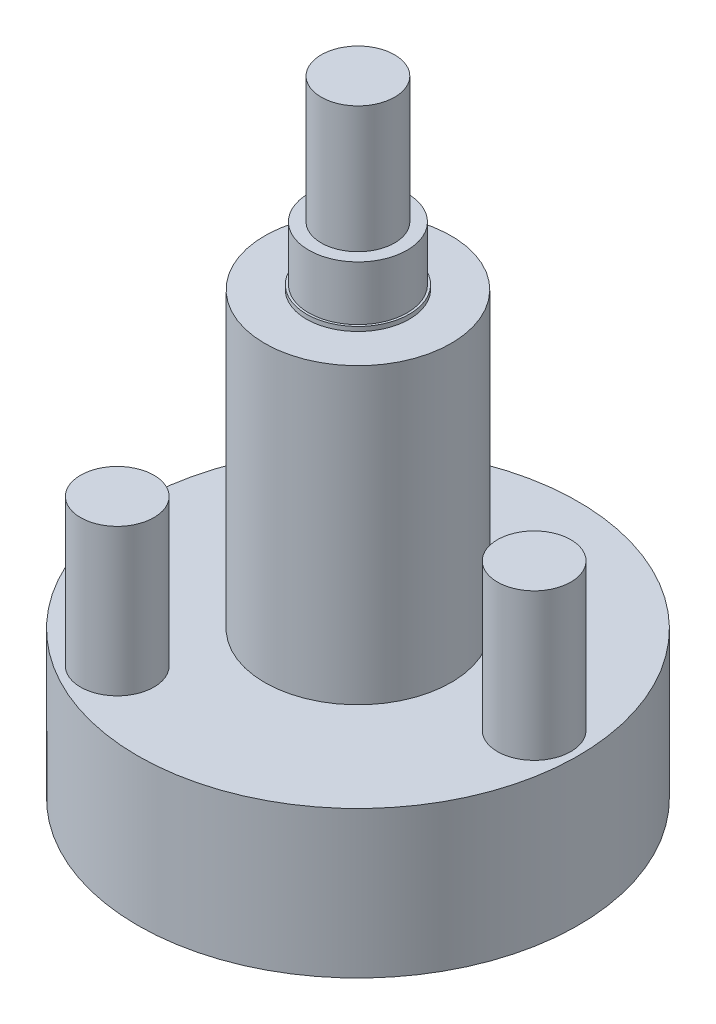
ISO-10303-21;
HEADER;
FILE_DESCRIPTION(('STEP AP214'),'2;1');
FILE_NAME('part.step','',(''),(''),'','','');
FILE_SCHEMA(('AUTOMOTIVE_DESIGN { 1 0 10303 214 1 1 1 1 }'));
ENDSEC;
DATA;
#1=APPLICATION_CONTEXT('core data for automotive mechanical design processes');
#2=APPLICATION_PROTOCOL_DEFINITION('international standard','automotive_design',2000,#1);
#3=PRODUCT_CONTEXT('',#1,'mechanical');
#4=PRODUCT('Part','Part','',(#3));
#5=PRODUCT_RELATED_PRODUCT_CATEGORY('part','',(#4));
#6=PRODUCT_DEFINITION_FORMATION('','',#4);
#7=PRODUCT_DEFINITION_CONTEXT('part definition',#1,'design');
#8=PRODUCT_DEFINITION('design','',#6,#7);
#9=PRODUCT_DEFINITION_SHAPE('','',#8);
#10=(LENGTH_UNIT() NAMED_UNIT(*) SI_UNIT(.MILLI.,.METRE.));
#11=(NAMED_UNIT(*) PLANE_ANGLE_UNIT() SI_UNIT($,.RADIAN.));
#12=(NAMED_UNIT(*) SI_UNIT($,.STERADIAN.) SOLID_ANGLE_UNIT());
#13=UNCERTAINTY_MEASURE_WITH_UNIT(LENGTH_MEASURE(1.E-05),#10,'distance_accuracy_value','');
#14=(GEOMETRIC_REPRESENTATION_CONTEXT(3) GLOBAL_UNCERTAINTY_ASSIGNED_CONTEXT((#13)) GLOBAL_UNIT_ASSIGNED_CONTEXT((#10,
#11,#12)) REPRESENTATION_CONTEXT('',''));
#15=CARTESIAN_POINT('',(0.,0.,0.));
#16=DIRECTION('',(0.,0.,1.));
#17=DIRECTION('',(1.,0.,0.));
#18=AXIS2_PLACEMENT_3D('',#15,#16,#17);
#19=CARTESIAN_POINT('',(0.,5.3,0.));
#20=DIRECTION('',(0.,-1.,0.));
#21=DIRECTION('',(0.,0.,-1.));
#22=AXIS2_PLACEMENT_3D('',#19,#20,#21);
#23=CYLINDRICAL_SURFACE('',#22,3.5);
#24=CARTESIAN_POINT('',(0.,5.3,0.));
#25=DIRECTION('',(0.,1.,0.));
#26=DIRECTION('',(0.,0.,1.));
#27=AXIS2_PLACEMENT_3D('',#24,#25,#26);
#28=CIRCLE('',#27,3.5);
#29=CARTESIAN_POINT('',(0.,5.3,3.5));
#30=VERTEX_POINT('',#29);
#31=EDGE_CURVE('E58',#30,#30,#28,.T.);
#32=ORIENTED_EDGE('',*,*,#31,.F.);
#33=EDGE_LOOP('',(#32));
#34=FACE_BOUND('',#33,.T.);
#35=CARTESIAN_POINT('',(0.,5.,0.));
#36=DIRECTION('',(0.,1.,0.));
#37=DIRECTION('',(0.,0.,1.));
#38=AXIS2_PLACEMENT_3D('',#35,#36,#37);
#39=CIRCLE('',#38,3.5);
#40=CARTESIAN_POINT('',(0.,5.,3.5));
#41=VERTEX_POINT('',#40);
#42=EDGE_CURVE('E59',#41,#41,#39,.T.);
#43=ORIENTED_EDGE('',*,*,#42,.T.);
#44=EDGE_LOOP('',(#43));
#45=FACE_BOUND('',#44,.T.);
#46=ADVANCED_FACE('F39',(#34,#45),#23,.T.);
#47=CARTESIAN_POINT('',(0.,5.,0.));
#48=DIRECTION('',(0.,1.,0.));
#49=DIRECTION('',(0.,0.,1.));
#50=AXIS2_PLACEMENT_3D('',#47,#48,#49);
#51=PLANE('',#50);
#52=CARTESIAN_POINT('',(0.,5.,0.));
#53=DIRECTION('',(0.,1.,0.));
#54=DIRECTION('',(0.,0.,1.));
#55=AXIS2_PLACEMENT_3D('',#52,#53,#54);
#56=CIRCLE('',#55,3.35);
#57=CARTESIAN_POINT('',(0.,5.,3.35));
#58=VERTEX_POINT('',#57);
#59=EDGE_CURVE('E10',#58,#58,#56,.F.);
#60=ORIENTED_EDGE('',*,*,#59,.F.);
#61=EDGE_LOOP('',(#60));
#62=FACE_BOUND('',#61,.T.);
#63=ORIENTED_EDGE('',*,*,#42,.F.);
#64=EDGE_LOOP('',(#63));
#65=FACE_BOUND('',#64,.T.);
#66=ADVANCED_FACE('F136',(#62,#65),#51,.F.);
#67=CARTESIAN_POINT('',(0.,15.3,0.));
#68=DIRECTION('',(0.,-1.,0.));
#69=DIRECTION('',(0.,0.,-1.));
#70=AXIS2_PLACEMENT_3D('',#67,#68,#69);
#71=CYLINDRICAL_SURFACE('',#70,15.);
#72=CARTESIAN_POINT('',(0.,15.3,0.));
#73=DIRECTION('',(0.,1.,0.));
#74=DIRECTION('',(0.,0.,1.));
#75=AXIS2_PLACEMENT_3D('',#72,#73,#74);
#76=CIRCLE('',#75,15.);
#77=CARTESIAN_POINT('',(0.,15.3,15.));
#78=VERTEX_POINT('',#77);
#79=EDGE_CURVE('E62',#78,#78,#76,.T.);
#80=ORIENTED_EDGE('',*,*,#79,.F.);
#81=EDGE_LOOP('',(#80));
#82=FACE_BOUND('',#81,.T.);
#83=CARTESIAN_POINT('',(0.,5.3,0.));
#84=DIRECTION('',(0.,1.,0.));
#85=DIRECTION('',(0.,0.,1.));
#86=AXIS2_PLACEMENT_3D('',#83,#84,#85);
#87=CIRCLE('',#86,15.);
#88=CARTESIAN_POINT('',(0.,5.3,15.));
#89=VERTEX_POINT('',#88);
#90=EDGE_CURVE('E65',#89,#89,#87,.T.);
#91=ORIENTED_EDGE('',*,*,#90,.T.);
#92=EDGE_LOOP('',(#91));
#93=FACE_BOUND('',#92,.T.);
#94=ADVANCED_FACE('F124',(#82,#93),#71,.T.);
#95=CARTESIAN_POINT('',(0.,15.3,0.));
#96=DIRECTION('',(0.,1.,0.));
#97=DIRECTION('',(0.,0.,1.));
#98=AXIS2_PLACEMENT_3D('',#95,#96,#97);
#99=PLANE('',#98);
#100=CARTESIAN_POINT('',(-5.9999999999999,15.3,10.3923048454133));
#101=DIRECTION('',(0.,1.,0.));
#102=DIRECTION('',(-0.866025403784443,0.,-0.499999999999992));
#103=AXIS2_PLACEMENT_3D('',#100,#101,#102);
#104=CIRCLE('',#103,2.5);
#105=CARTESIAN_POINT('',(-8.16506350946101,15.3,9.14230484541334));
#106=VERTEX_POINT('',#105);
#107=EDGE_CURVE('E105',#106,#106,#104,.T.);
#108=ORIENTED_EDGE('',*,*,#107,.F.);
#109=EDGE_LOOP('',(#108));
#110=FACE_BOUND('',#109,.T.);
#111=CARTESIAN_POINT('',(-6.00000000000005,15.3,-10.3923048454132));
#112=DIRECTION('',(0.,1.,0.));
#113=DIRECTION('',(0.866025403784436,0.,-0.500000000000004));
#114=AXIS2_PLACEMENT_3D('',#111,#112,#113);
#115=CIRCLE('',#114,2.5);
#116=CARTESIAN_POINT('',(-3.83493649053896,15.3,-11.6423048454132));
#117=VERTEX_POINT('',#116);
#118=EDGE_CURVE('E99',#117,#117,#115,.T.);
#119=ORIENTED_EDGE('',*,*,#118,.F.);
#120=EDGE_LOOP('',(#119));
#121=FACE_BOUND('',#120,.T.);
#122=CARTESIAN_POINT('',(12.,15.3,0.));
#123=DIRECTION('',(0.,1.,0.));
#124=DIRECTION('',(0.,0.,1.));
#125=AXIS2_PLACEMENT_3D('',#122,#123,#124);
#126=CIRCLE('',#125,2.5);
#127=CARTESIAN_POINT('',(12.,15.3,2.5));
#128=VERTEX_POINT('',#127);
#129=EDGE_CURVE('E93',#128,#128,#126,.T.);
#130=ORIENTED_EDGE('',*,*,#129,.F.);
#131=EDGE_LOOP('',(#130));
#132=FACE_BOUND('',#131,.T.);
#133=CARTESIAN_POINT('',(0.,15.3,0.));
#134=DIRECTION('',(0.,1.,0.));
#135=DIRECTION('',(0.,0.,1.));
#136=AXIS2_PLACEMENT_3D('',#133,#134,#135);
#137=CIRCLE('',#136,6.35);
#138=CARTESIAN_POINT('',(0.,15.3,6.35));
#139=VERTEX_POINT('',#138);
#140=EDGE_CURVE('E57',#139,#139,#137,.T.);
#141=ORIENTED_EDGE('',*,*,#140,.F.);
#142=EDGE_LOOP('',(#141));
#143=FACE_BOUND('',#142,.T.);
#144=ORIENTED_EDGE('',*,*,#79,.T.);
#145=EDGE_LOOP('',(#144));
#146=FACE_BOUND('',#145,.T.);
#147=ADVANCED_FACE('F120',(#110,#121,#132,#143,#146),#99,.T.);
#148=CARTESIAN_POINT('',(0.,5.3,0.));
#149=DIRECTION('',(0.,1.,0.));
#150=DIRECTION('',(0.,0.,1.));
#151=AXIS2_PLACEMENT_3D('',#148,#149,#150);
#152=PLANE('',#151);
#153=ORIENTED_EDGE('',*,*,#31,.T.);
#154=EDGE_LOOP('',(#153));
#155=FACE_BOUND('',#154,.T.);
#156=ORIENTED_EDGE('',*,*,#90,.F.);
#157=EDGE_LOOP('',(#156));
#158=FACE_BOUND('',#157,.T.);
#159=ADVANCED_FACE('F123',(#155,#158),#152,.F.);
#160=CARTESIAN_POINT('',(0.,25.3,0.));
#161=DIRECTION('',(0.,-1.,0.));
#162=DIRECTION('',(0.,0.,-1.));
#163=AXIS2_PLACEMENT_3D('',#160,#161,#162);
#164=CYLINDRICAL_SURFACE('',#163,6.35);
#165=ORIENTED_EDGE('',*,*,#140,.T.);
#166=EDGE_LOOP('',(#165));
#167=FACE_BOUND('',#166,.T.);
#168=CARTESIAN_POINT('',(0.,35.3,0.));
#169=DIRECTION('',(0.,1.,0.));
#170=DIRECTION('',(0.,0.,1.));
#171=AXIS2_PLACEMENT_3D('',#168,#169,#170);
#172=CIRCLE('',#171,6.35);
#173=CARTESIAN_POINT('',(0.,35.3,6.35));
#174=VERTEX_POINT('',#173);
#175=EDGE_CURVE('E68',#174,#174,#172,.T.);
#176=ORIENTED_EDGE('',*,*,#175,.F.);
#177=EDGE_LOOP('',(#176));
#178=FACE_BOUND('',#177,.T.);
#179=ADVANCED_FACE('F141',(#167,#178),#164,.T.);
#180=CARTESIAN_POINT('',(0.,35.3,0.));
#181=DIRECTION('',(0.,1.,0.));
#182=DIRECTION('',(0.,0.,1.));
#183=AXIS2_PLACEMENT_3D('',#180,#181,#182);
#184=PLANE('',#183);
#185=CARTESIAN_POINT('',(0.,35.3,0.));
#186=DIRECTION('',(0.,1.,0.));
#187=DIRECTION('',(0.,0.,1.));
#188=AXIS2_PLACEMENT_3D('',#185,#186,#187);
#189=CIRCLE('',#188,3.5);
#190=CARTESIAN_POINT('',(0.,35.3,3.5));
#191=VERTEX_POINT('',#190);
#192=EDGE_CURVE('E73',#191,#191,#189,.T.);
#193=ORIENTED_EDGE('',*,*,#192,.F.);
#194=EDGE_LOOP('',(#193));
#195=FACE_BOUND('',#194,.T.);
#196=ORIENTED_EDGE('',*,*,#175,.T.);
#197=EDGE_LOOP('',(#196));
#198=FACE_BOUND('',#197,.T.);
#199=ADVANCED_FACE('F147',(#195,#198),#184,.T.);
#200=CARTESIAN_POINT('',(0.,35.6,0.));
#201=DIRECTION('',(0.,-1.,0.));
#202=DIRECTION('',(0.,0.,-1.));
#203=AXIS2_PLACEMENT_3D('',#200,#201,#202);
#204=CYLINDRICAL_SURFACE('',#203,3.5);
#205=CARTESIAN_POINT('',(0.,35.6,0.));
#206=DIRECTION('',(0.,1.,0.));
#207=DIRECTION('',(0.,0.,1.));
#208=AXIS2_PLACEMENT_3D('',#205,#206,#207);
#209=CIRCLE('',#208,3.5);
#210=CARTESIAN_POINT('',(0.,35.6,3.5));
#211=VERTEX_POINT('',#210);
#212=EDGE_CURVE('E76',#211,#211,#209,.T.);
#213=ORIENTED_EDGE('',*,*,#212,.F.);
#214=EDGE_LOOP('',(#213));
#215=FACE_BOUND('',#214,.T.);
#216=ORIENTED_EDGE('',*,*,#192,.T.);
#217=EDGE_LOOP('',(#216));
#218=FACE_BOUND('',#217,.T.);
#219=ADVANCED_FACE('F200',(#215,#218),#204,.T.);
#220=CARTESIAN_POINT('',(0.,35.6,0.));
#221=DIRECTION('',(0.,1.,0.));
#222=DIRECTION('',(0.,0.,1.));
#223=AXIS2_PLACEMENT_3D('',#220,#221,#222);
#224=PLANE('',#223);
#225=CARTESIAN_POINT('',(0.,35.6,0.));
#226=DIRECTION('',(0.,1.,0.));
#227=DIRECTION('',(0.,0.,1.));
#228=AXIS2_PLACEMENT_3D('',#225,#226,#227);
#229=CIRCLE('',#228,3.35);
#230=CARTESIAN_POINT('',(0.,35.6,3.35));
#231=VERTEX_POINT('',#230);
#232=EDGE_CURVE('E51',#231,#231,#229,.T.);
#233=ORIENTED_EDGE('',*,*,#232,.F.);
#234=EDGE_LOOP('',(#233));
#235=FACE_BOUND('',#234,.T.);
#236=ORIENTED_EDGE('',*,*,#212,.T.);
#237=EDGE_LOOP('',(#236));
#238=FACE_BOUND('',#237,.T.);
#239=ADVANCED_FACE('F196',(#235,#238),#224,.T.);
#240=CARTESIAN_POINT('',(0.,39.3,0.));
#241=DIRECTION('',(0.,-1.,0.));
#242=DIRECTION('',(0.,0.,-1.));
#243=AXIS2_PLACEMENT_3D('',#240,#241,#242);
#244=CYLINDRICAL_SURFACE('',#243,3.35);
#245=CARTESIAN_POINT('',(0.,39.3,0.));
#246=DIRECTION('',(0.,1.,0.));
#247=DIRECTION('',(0.,0.,1.));
#248=AXIS2_PLACEMENT_3D('',#245,#246,#247);
#249=CIRCLE('',#248,3.35);
#250=CARTESIAN_POINT('',(0.,39.3,3.35));
#251=VERTEX_POINT('',#250);
#252=EDGE_CURVE('E81',#251,#251,#249,.T.);
#253=ORIENTED_EDGE('',*,*,#252,.F.);
#254=EDGE_LOOP('',(#253));
#255=FACE_BOUND('',#254,.T.);
#256=ORIENTED_EDGE('',*,*,#232,.T.);
#257=EDGE_LOOP('',(#256));
#258=FACE_BOUND('',#257,.T.);
#259=ADVANCED_FACE('F192',(#255,#258),#244,.T.);
#260=CARTESIAN_POINT('',(0.,39.3,0.));
#261=DIRECTION('',(0.,1.,0.));
#262=DIRECTION('',(0.,0.,1.));
#263=AXIS2_PLACEMENT_3D('',#260,#261,#262);
#264=PLANE('',#263);
#265=CARTESIAN_POINT('',(0.,39.3,0.));
#266=DIRECTION('',(0.,1.,0.));
#267=DIRECTION('',(0.,0.,1.));
#268=AXIS2_PLACEMENT_3D('',#265,#266,#267);
#269=CIRCLE('',#268,2.5);
#270=CARTESIAN_POINT('',(0.,39.3,2.5));
#271=VERTEX_POINT('',#270);
#272=EDGE_CURVE('E47',#271,#271,#269,.T.);
#273=ORIENTED_EDGE('',*,*,#272,.F.);
#274=EDGE_LOOP('',(#273));
#275=FACE_BOUND('',#274,.T.);
#276=ORIENTED_EDGE('',*,*,#252,.T.);
#277=EDGE_LOOP('',(#276));
#278=FACE_BOUND('',#277,.T.);
#279=ADVANCED_FACE('F188',(#275,#278),#264,.T.);
#280=CARTESIAN_POINT('',(0.,42.3,0.));
#281=DIRECTION('',(0.,-1.,0.));
#282=DIRECTION('',(0.,0.,-1.));
#283=AXIS2_PLACEMENT_3D('',#280,#281,#282);
#284=CYLINDRICAL_SURFACE('',#283,2.5);
#285=ORIENTED_EDGE('',*,*,#272,.T.);
#286=EDGE_LOOP('',(#285));
#287=FACE_BOUND('',#286,.T.);
#288=CARTESIAN_POINT('',(0.,47.9,0.));
#289=DIRECTION('',(0.,1.,0.));
#290=DIRECTION('',(0.,0.,1.));
#291=AXIS2_PLACEMENT_3D('',#288,#289,#290);
#292=CIRCLE('',#291,2.5);
#293=CARTESIAN_POINT('',(0.,47.9,2.5));
#294=VERTEX_POINT('',#293);
#295=EDGE_CURVE('E89',#294,#294,#292,.T.);
#296=ORIENTED_EDGE('',*,*,#295,.F.);
#297=EDGE_LOOP('',(#296));
#298=FACE_BOUND('',#297,.T.);
#299=ADVANCED_FACE('F178',(#287,#298),#284,.T.);
#300=CARTESIAN_POINT('',(0.,1.3,0.));
#301=DIRECTION('',(0.,1.,0.));
#302=DIRECTION('',(0.,0.,1.));
#303=AXIS2_PLACEMENT_3D('',#300,#301,#302);
#304=CYLINDRICAL_SURFACE('',#303,3.35);
#305=CARTESIAN_POINT('',(0.,1.3,0.));
#306=DIRECTION('',(0.,-1.,0.));
#307=DIRECTION('',(0.,0.,-1.));
#308=AXIS2_PLACEMENT_3D('',#305,#306,#307);
#309=CIRCLE('',#308,3.35);
#310=CARTESIAN_POINT('',(0.,1.3,-3.35));
#311=VERTEX_POINT('',#310);
#312=EDGE_CURVE('E86',#311,#311,#309,.T.);
#313=ORIENTED_EDGE('',*,*,#312,.F.);
#314=EDGE_LOOP('',(#313));
#315=FACE_BOUND('',#314,.T.);
#316=ORIENTED_EDGE('',*,*,#59,.T.);
#317=EDGE_LOOP('',(#316));
#318=FACE_BOUND('',#317,.T.);
#319=ADVANCED_FACE('F170',(#315,#318),#304,.T.);
#320=CARTESIAN_POINT('',(0.,1.3,0.));
#321=DIRECTION('',(0.,-1.,0.));
#322=DIRECTION('',(0.,0.,-1.));
#323=AXIS2_PLACEMENT_3D('',#320,#321,#322);
#324=PLANE('',#323);
#325=CARTESIAN_POINT('',(0.,1.3,0.));
#326=DIRECTION('',(0.,-1.,0.));
#327=DIRECTION('',(0.,0.,-1.));
#328=AXIS2_PLACEMENT_3D('',#325,#326,#327);
#329=CIRCLE('',#328,2.5);
#330=CARTESIAN_POINT('',(0.,1.3,-2.5));
#331=VERTEX_POINT('',#330);
#332=EDGE_CURVE('E43',#331,#331,#329,.T.);
#333=ORIENTED_EDGE('',*,*,#332,.F.);
#334=EDGE_LOOP('',(#333));
#335=FACE_BOUND('',#334,.T.);
#336=ORIENTED_EDGE('',*,*,#312,.T.);
#337=EDGE_LOOP('',(#336));
#338=FACE_BOUND('',#337,.T.);
#339=ADVANCED_FACE('F162',(#335,#338),#324,.T.);
#340=CARTESIAN_POINT('',(0.,0.,0.));
#341=DIRECTION('',(0.,1.,0.));
#342=DIRECTION('',(0.,0.,1.));
#343=AXIS2_PLACEMENT_3D('',#340,#341,#342);
#344=PLANE('',#343);
#345=CARTESIAN_POINT('',(0.,0.,0.));
#346=DIRECTION('',(0.,1.,0.));
#347=DIRECTION('',(0.,0.,1.));
#348=AXIS2_PLACEMENT_3D('',#345,#346,#347);
#349=CIRCLE('',#348,2.5);
#350=CARTESIAN_POINT('',(0.,0.,2.5));
#351=VERTEX_POINT('',#350);
#352=EDGE_CURVE('E54',#351,#351,#349,.T.);
#353=ORIENTED_EDGE('',*,*,#352,.F.);
#354=EDGE_LOOP('',(#353));
#355=FACE_BOUND('',#354,.T.);
#356=ADVANCED_FACE('F160',(#355),#344,.F.);
#357=CARTESIAN_POINT('',(0.,5.,0.));
#358=DIRECTION('',(0.,-1.,0.));
#359=DIRECTION('',(0.,0.,-1.));
#360=AXIS2_PLACEMENT_3D('',#357,#358,#359);
#361=CYLINDRICAL_SURFACE('',#360,2.5);
#362=ORIENTED_EDGE('',*,*,#332,.T.);
#363=EDGE_LOOP('',(#362));
#364=FACE_BOUND('',#363,.T.);
#365=ORIENTED_EDGE('',*,*,#352,.T.);
#366=EDGE_LOOP('',(#365));
#367=FACE_BOUND('',#366,.T.);
#368=ADVANCED_FACE('F41',(#364,#367),#361,.T.);
#369=CARTESIAN_POINT('',(0.,47.9,0.));
#370=DIRECTION('',(0.,1.,0.));
#371=DIRECTION('',(0.,0.,1.));
#372=AXIS2_PLACEMENT_3D('',#369,#370,#371);
#373=PLANE('',#372);
#374=ORIENTED_EDGE('',*,*,#295,.T.);
#375=EDGE_LOOP('',(#374));
#376=FACE_BOUND('',#375,.T.);
#377=ADVANCED_FACE('F168',(#376),#373,.T.);
#378=CARTESIAN_POINT('',(12.,25.3,0.));
#379=DIRECTION('',(0.,-1.,0.));
#380=DIRECTION('',(0.,0.,-1.));
#381=AXIS2_PLACEMENT_3D('',#378,#379,#380);
#382=CYLINDRICAL_SURFACE('',#381,2.5);
#383=CARTESIAN_POINT('',(12.,25.3,0.));
#384=DIRECTION('',(0.,1.,0.));
#385=DIRECTION('',(0.,0.,1.));
#386=AXIS2_PLACEMENT_3D('',#383,#384,#385);
#387=CIRCLE('',#386,2.5);
#388=CARTESIAN_POINT('',(12.,25.3,2.5));
#389=VERTEX_POINT('',#388);
#390=EDGE_CURVE('E92',#389,#389,#387,.T.);
#391=ORIENTED_EDGE('',*,*,#390,.F.);
#392=EDGE_LOOP('',(#391));
#393=FACE_BOUND('',#392,.T.);
#394=ORIENTED_EDGE('',*,*,#129,.T.);
#395=EDGE_LOOP('',(#394));
#396=FACE_BOUND('',#395,.T.);
#397=ADVANCED_FACE('F271',(#393,#396),#382,.T.);
#398=CARTESIAN_POINT('',(12.,25.3,0.));
#399=DIRECTION('',(0.,1.,0.));
#400=DIRECTION('',(0.,0.,1.));
#401=AXIS2_PLACEMENT_3D('',#398,#399,#400);
#402=PLANE('',#401);
#403=ORIENTED_EDGE('',*,*,#390,.T.);
#404=EDGE_LOOP('',(#403));
#405=FACE_BOUND('',#404,.T.);
#406=ADVANCED_FACE('F281',(#405),#402,.T.);
#407=CARTESIAN_POINT('',(-6.00000000000005,25.3,-10.3923048454132));
#408=DIRECTION('',(0.,-1.,0.));
#409=DIRECTION('',(0.,0.,-1.));
#410=AXIS2_PLACEMENT_3D('',#407,#408,#409);
#411=CYLINDRICAL_SURFACE('',#410,2.5);
#412=CARTESIAN_POINT('',(-6.00000000000005,25.3,-10.3923048454132));
#413=DIRECTION('',(0.,1.,0.));
#414=DIRECTION('',(0.866025403784436,0.,-0.500000000000004));
#415=AXIS2_PLACEMENT_3D('',#412,#413,#414);
#416=CIRCLE('',#415,2.5);
#417=CARTESIAN_POINT('',(-3.83493649053896,25.3,-11.6423048454132));
#418=VERTEX_POINT('',#417);
#419=EDGE_CURVE('E96',#418,#418,#416,.T.);
#420=ORIENTED_EDGE('',*,*,#419,.F.);
#421=EDGE_LOOP('',(#420));
#422=FACE_BOUND('',#421,.T.);
#423=ORIENTED_EDGE('',*,*,#118,.T.);
#424=EDGE_LOOP('',(#423));
#425=FACE_BOUND('',#424,.T.);
#426=ADVANCED_FACE('F291',(#422,#425),#411,.T.);
#427=CARTESIAN_POINT('',(-6.00000000000005,25.3,-10.3923048454132));
#428=DIRECTION('',(0.,1.,0.));
#429=DIRECTION('',(0.866025403784436,0.,-0.500000000000004));
#430=AXIS2_PLACEMENT_3D('',#427,#428,#429);
#431=PLANE('',#430);
#432=ORIENTED_EDGE('',*,*,#419,.T.);
#433=EDGE_LOOP('',(#432));
#434=FACE_BOUND('',#433,.T.);
#435=ADVANCED_FACE('F116',(#434),#431,.T.);
#436=CARTESIAN_POINT('',(-5.9999999999999,25.3,10.3923048454133));
#437=DIRECTION('',(0.,-1.,0.));
#438=DIRECTION('',(0.,0.,-1.));
#439=AXIS2_PLACEMENT_3D('',#436,#437,#438);
#440=CYLINDRICAL_SURFACE('',#439,2.5);
#441=CARTESIAN_POINT('',(-5.9999999999999,25.3,10.3923048454133));
#442=DIRECTION('',(0.,1.,0.));
#443=DIRECTION('',(-0.866025403784443,0.,-0.499999999999992));
#444=AXIS2_PLACEMENT_3D('',#441,#442,#443);
#445=CIRCLE('',#444,2.5);
#446=CARTESIAN_POINT('',(-8.16506350946101,25.3,9.14230484541334));
#447=VERTEX_POINT('',#446);
#448=EDGE_CURVE('E102',#447,#447,#445,.T.);
#449=ORIENTED_EDGE('',*,*,#448,.F.);
#450=EDGE_LOOP('',(#449));
#451=FACE_BOUND('',#450,.T.);
#452=ORIENTED_EDGE('',*,*,#107,.T.);
#453=EDGE_LOOP('',(#452));
#454=FACE_BOUND('',#453,.T.);
#455=ADVANCED_FACE('F113',(#451,#454),#440,.T.);
#456=CARTESIAN_POINT('',(-5.9999999999999,25.3,10.3923048454133));
#457=DIRECTION('',(0.,1.,0.));
#458=DIRECTION('',(-0.866025403784443,0.,-0.499999999999992));
#459=AXIS2_PLACEMENT_3D('',#456,#457,#458);
#460=PLANE('',#459);
#461=ORIENTED_EDGE('',*,*,#448,.T.);
#462=EDGE_LOOP('',(#461));
#463=FACE_BOUND('',#462,.T.);
#464=ADVANCED_FACE('F111',(#463),#460,.T.);
#465=CLOSED_SHELL('',(#46,#66,#94,#147,#159,#179,#199,#219,#239,#259,#279,#299,#319,#339,#356,
#368,#377,#397,#406,#426,#435,#455,#464));
#466=MANIFOLD_SOLID_BREP('B2',#465);
#467=ADVANCED_BREP_SHAPE_REPRESENTATION('',(#18,#466),#14);
#468=SHAPE_DEFINITION_REPRESENTATION(#9,#467);
ENDSEC;
END-ISO-10303-21;
